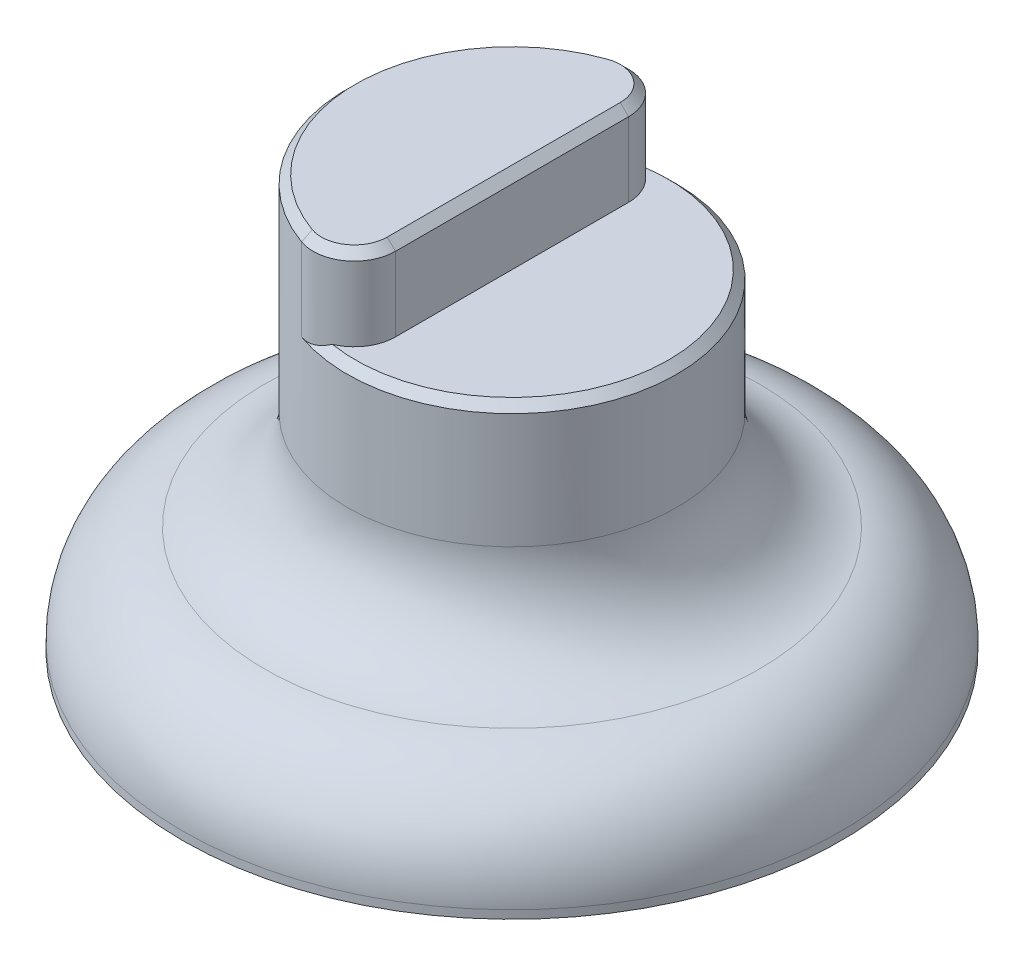
ISO-10303-21;
HEADER;
FILE_DESCRIPTION(('STEP AP214'),'2;1');
FILE_NAME('part.step','',(''),(''),'','','');
FILE_SCHEMA(('AUTOMOTIVE_DESIGN { 1 0 10303 214 1 1 1 1 }'));
ENDSEC;
DATA;
#1=APPLICATION_CONTEXT('core data for automotive mechanical design processes');
#2=APPLICATION_PROTOCOL_DEFINITION('international standard','automotive_design',2000,#1);
#3=PRODUCT_CONTEXT('',#1,'mechanical');
#4=PRODUCT('Part','Part','',(#3));
#5=PRODUCT_RELATED_PRODUCT_CATEGORY('part','',(#4));
#6=PRODUCT_DEFINITION_FORMATION('','',#4);
#7=PRODUCT_DEFINITION_CONTEXT('part definition',#1,'design');
#8=PRODUCT_DEFINITION('design','',#6,#7);
#9=PRODUCT_DEFINITION_SHAPE('','',#8);
#10=(LENGTH_UNIT() NAMED_UNIT(*) SI_UNIT(.MILLI.,.METRE.));
#11=(NAMED_UNIT(*) PLANE_ANGLE_UNIT() SI_UNIT($,.RADIAN.));
#12=(NAMED_UNIT(*) SI_UNIT($,.STERADIAN.) SOLID_ANGLE_UNIT());
#13=UNCERTAINTY_MEASURE_WITH_UNIT(LENGTH_MEASURE(1.E-05),#10,'distance_accuracy_value','');
#14=(GEOMETRIC_REPRESENTATION_CONTEXT(3) GLOBAL_UNCERTAINTY_ASSIGNED_CONTEXT((#13)) GLOBAL_UNIT_ASSIGNED_CONTEXT((#10,
#11,#12)) REPRESENTATION_CONTEXT('',''));
#15=CARTESIAN_POINT('',(0.,0.,0.));
#16=DIRECTION('',(0.,0.,1.));
#17=DIRECTION('',(1.,0.,0.));
#18=AXIS2_PLACEMENT_3D('',#15,#16,#17);
#19=CARTESIAN_POINT('',(0.,0.,0.));
#20=DIRECTION('',(0.,-1.,0.));
#21=DIRECTION('',(0.,0.,-1.));
#22=AXIS2_PLACEMENT_3D('',#19,#20,#21);
#23=PLANE('',#22);
#24=CARTESIAN_POINT('',(0.,0.,0.));
#25=DIRECTION('',(0.,-1.,0.));
#26=DIRECTION('',(0.,0.,-1.));
#27=AXIS2_PLACEMENT_3D('',#24,#25,#26);
#28=CIRCLE('',#27,40.);
#29=CARTESIAN_POINT('',(0.,0.,-40.));
#30=VERTEX_POINT('',#29);
#31=EDGE_CURVE('E153',#30,#30,#28,.T.);
#32=ORIENTED_EDGE('',*,*,#31,.T.);
#33=EDGE_LOOP('',(#32));
#34=FACE_BOUND('',#33,.T.);
#35=ADVANCED_FACE('F47',(#34),#23,.T.);
#36=CARTESIAN_POINT('',(0.,0.,0.));
#37=DIRECTION('',(0.,-1.,0.));
#38=DIRECTION('',(0.,0.,-1.));
#39=AXIS2_PLACEMENT_3D('',#36,#37,#38);
#40=CYLINDRICAL_SURFACE('',#39,40.);
#41=CARTESIAN_POINT('',(0.,1.,0.));
#42=DIRECTION('',(0.,-1.,0.));
#43=DIRECTION('',(0.,0.,-1.));
#44=AXIS2_PLACEMENT_3D('',#41,#42,#43);
#45=CIRCLE('',#44,40.);
#46=CARTESIAN_POINT('',(0.,1.,-40.));
#47=VERTEX_POINT('',#46);
#48=EDGE_CURVE('E149',#47,#47,#45,.T.);
#49=ORIENTED_EDGE('',*,*,#48,.T.);
#50=EDGE_LOOP('',(#49));
#51=FACE_BOUND('',#50,.T.);
#52=ORIENTED_EDGE('',*,*,#31,.F.);
#53=EDGE_LOOP('',(#52));
#54=FACE_BOUND('',#53,.T.);
#55=ADVANCED_FACE('F242',(#51,#54),#40,.T.);
#56=CARTESIAN_POINT('',(0.,1.,0.));
#57=DIRECTION('',(0.,-1.,0.));
#58=DIRECTION('',(0.,0.,-1.));
#59=AXIS2_PLACEMENT_3D('',#56,#57,#58);
#60=TOROIDAL_SURFACE('',#59,27.8000000000001,12.2);
#61=CARTESIAN_POINT('',(0.,13.,0.));
#62=DIRECTION('',(0.,-1.,0.));
#63=DIRECTION('',(0.,0.,-1.));
#64=AXIS2_PLACEMENT_3D('',#61,#62,#63);
#65=CIRCLE('',#64,30.);
#66=CARTESIAN_POINT('',(0.,13.,-30.));
#67=VERTEX_POINT('',#66);
#68=EDGE_CURVE('E141',#67,#67,#65,.T.);
#69=ORIENTED_EDGE('',*,*,#68,.T.);
#70=EDGE_LOOP('',(#69));
#71=FACE_BOUND('',#70,.T.);
#72=ORIENTED_EDGE('',*,*,#48,.F.);
#73=EDGE_LOOP('',(#72));
#74=FACE_BOUND('',#73,.T.);
#75=ADVANCED_FACE('F247',(#71,#74),#60,.T.);
#76=CARTESIAN_POINT('',(0.,25.,0.));
#77=DIRECTION('',(0.,-1.,0.));
#78=DIRECTION('',(0.,0.,-1.));
#79=AXIS2_PLACEMENT_3D('',#76,#77,#78);
#80=TOROIDAL_SURFACE('',#79,32.2,12.2);
#81=CARTESIAN_POINT('',(0.,25.,0.));
#82=DIRECTION('',(0.,-1.,0.));
#83=DIRECTION('',(0.,0.,-1.));
#84=AXIS2_PLACEMENT_3D('',#81,#82,#83);
#85=CIRCLE('',#84,20.);
#86=CARTESIAN_POINT('',(0.,25.,-20.));
#87=VERTEX_POINT('',#86);
#88=EDGE_CURVE('E136',#87,#87,#85,.T.);
#89=ORIENTED_EDGE('',*,*,#88,.T.);
#90=EDGE_LOOP('',(#89));
#91=FACE_BOUND('',#90,.T.);
#92=ORIENTED_EDGE('',*,*,#68,.F.);
#93=EDGE_LOOP('',(#92));
#94=FACE_BOUND('',#93,.T.);
#95=ADVANCED_FACE('F253',(#91,#94),#80,.F.);
#96=CARTESIAN_POINT('',(0.,0.,0.));
#97=DIRECTION('',(0.,-1.,0.));
#98=DIRECTION('',(0.,0.,-1.));
#99=AXIS2_PLACEMENT_3D('',#96,#97,#98);
#100=CYLINDRICAL_SURFACE('',#99,20.);
#101=DIRECTION('',(0.,-1.,0.));
#102=VECTOR('',#101,1.);
#103=CARTESIAN_POINT('',(-6.66666666666666,0.,18.8561808316413));
#104=LINE('',#103,#102);
#105=CARTESIAN_POINT('',(-6.66666666666666,39.,18.8561808316413));
#106=VERTEX_POINT('',#105);
#107=CARTESIAN_POINT('',(-6.66666666666666,49.,18.8561808316413));
#108=VERTEX_POINT('',#107);
#109=EDGE_CURVE('E67',#106,#108,#104,.F.);
#110=ORIENTED_EDGE('',*,*,#109,.T.);
#111=CARTESIAN_POINT('',(0.,49.,0.));
#112=DIRECTION('',(0.,1.,0.));
#113=DIRECTION('',(0.,0.,1.));
#114=AXIS2_PLACEMENT_3D('',#111,#112,#113);
#115=CIRCLE('',#114,20.);
#116=CARTESIAN_POINT('',(-6.66666666666666,49.,-18.8561808316413));
#117=VERTEX_POINT('',#116);
#118=EDGE_CURVE('E188',#108,#117,#115,.F.);
#119=ORIENTED_EDGE('',*,*,#118,.T.);
#120=DIRECTION('',(0.,-1.,0.));
#121=VECTOR('',#120,1.);
#122=CARTESIAN_POINT('',(-6.66666666666666,0.,-18.8561808316413));
#123=LINE('',#122,#121);
#124=CARTESIAN_POINT('',(-6.66666666666666,39.,-18.8561808316413));
#125=VERTEX_POINT('',#124);
#126=EDGE_CURVE('E75',#117,#125,#123,.T.);
#127=ORIENTED_EDGE('',*,*,#126,.T.);
#128=CARTESIAN_POINT('',(0.,39.,0.));
#129=DIRECTION('',(0.,1.,0.));
#130=DIRECTION('',(0.,0.,1.));
#131=AXIS2_PLACEMENT_3D('',#128,#129,#130);
#132=CIRCLE('',#131,20.);
#133=EDGE_CURVE('E185',#125,#106,#132,.F.);
#134=ORIENTED_EDGE('',*,*,#133,.T.);
#135=EDGE_LOOP('',(#110,#119,#127,#134));
#136=FACE_BOUND('',#135,.T.);
#137=ORIENTED_EDGE('',*,*,#88,.F.);
#138=EDGE_LOOP('',(#137));
#139=FACE_BOUND('',#138,.T.);
#140=ADVANCED_FACE('F257',(#136,#139),#100,.T.);
#141=CARTESIAN_POINT('',(0.,40.,0.));
#142=DIRECTION('',(0.,1.,0.));
#143=DIRECTION('',(0.,0.,1.));
#144=AXIS2_PLACEMENT_3D('',#141,#142,#143);
#145=PLANE('',#144);
#146=CARTESIAN_POINT('',(-5.,40.,14.142135623731));
#147=DIRECTION('',(0.,1.,0.));
#148=DIRECTION('',(0.,0.,1.));
#149=AXIS2_PLACEMENT_3D('',#146,#147,#148);
#150=CIRCLE('',#149,5.);
#151=CARTESIAN_POINT('',(0.,40.,14.142135623731));
#152=VERTEX_POINT('',#151);
#153=CARTESIAN_POINT('',(-3.06263414650818,40.,18.7515405256379));
#154=VERTEX_POINT('',#153);
#155=EDGE_CURVE('E125',#152,#154,#150,.F.);
#156=ORIENTED_EDGE('',*,*,#155,.T.);
#157=CARTESIAN_POINT('',(0.,40.,0.));
#158=DIRECTION('',(0.,1.,0.));
#159=DIRECTION('',(0.,0.,1.));
#160=AXIS2_PLACEMENT_3D('',#157,#158,#159);
#161=CIRCLE('',#160,19.);
#162=CARTESIAN_POINT('',(-3.06263414650818,40.,-18.7515405256379));
#163=VERTEX_POINT('',#162);
#164=EDGE_CURVE('E191',#154,#163,#161,.T.);
#165=ORIENTED_EDGE('',*,*,#164,.T.);
#166=CARTESIAN_POINT('',(-5.,40.,-14.142135623731));
#167=DIRECTION('',(0.,1.,0.));
#168=DIRECTION('',(0.,0.,1.));
#169=AXIS2_PLACEMENT_3D('',#166,#167,#168);
#170=CIRCLE('',#169,5.);
#171=CARTESIAN_POINT('',(0.,40.,-14.142135623731));
#172=VERTEX_POINT('',#171);
#173=EDGE_CURVE('E131',#163,#172,#170,.F.);
#174=ORIENTED_EDGE('',*,*,#173,.T.);
#175=DIRECTION('',(0.,0.,-1.));
#176=VECTOR('',#175,1.);
#177=CARTESIAN_POINT('',(0.,40.,-20.));
#178=LINE('',#177,#176);
#179=EDGE_CURVE('E117',#152,#172,#178,.T.);
#180=ORIENTED_EDGE('',*,*,#179,.F.);
#181=EDGE_LOOP('',(#156,#165,#174,#180));
#182=FACE_BOUND('',#181,.T.);
#183=ADVANCED_FACE('F133',(#182),#145,.T.);
#184=CARTESIAN_POINT('',(0.,50.,-20.));
#185=DIRECTION('',(-1.,0.,0.));
#186=DIRECTION('',(0.,0.,1.));
#187=AXIS2_PLACEMENT_3D('',#184,#185,#186);
#188=PLANE('',#187);
#189=DIRECTION('',(0.,1.,0.));
#190=VECTOR('',#189,1.);
#191=CARTESIAN_POINT('',(0.,50.,-14.142135623731));
#192=LINE('',#191,#190);
#193=CARTESIAN_POINT('',(0.,49.,-14.142135623731));
#194=VERTEX_POINT('',#193);
#195=EDGE_CURVE('E122',#172,#194,#192,.T.);
#196=ORIENTED_EDGE('',*,*,#195,.T.);
#197=DIRECTION('',(0.,0.,1.));
#198=VECTOR('',#197,1.);
#199=CARTESIAN_POINT('',(0.,49.,14.142135623731));
#200=LINE('',#199,#198);
#201=CARTESIAN_POINT('',(0.,49.,14.142135623731));
#202=VERTEX_POINT('',#201);
#203=EDGE_CURVE('E120',#194,#202,#200,.T.);
#204=ORIENTED_EDGE('',*,*,#203,.T.);
#205=DIRECTION('',(0.,1.,0.));
#206=VECTOR('',#205,1.);
#207=CARTESIAN_POINT('',(0.,40.,14.142135623731));
#208=LINE('',#207,#206);
#209=EDGE_CURVE('E112',#202,#152,#208,.F.);
#210=ORIENTED_EDGE('',*,*,#209,.T.);
#211=ORIENTED_EDGE('',*,*,#179,.T.);
#212=EDGE_LOOP('',(#196,#204,#210,#211));
#213=FACE_BOUND('',#212,.T.);
#214=ADVANCED_FACE('F115',(#213),#188,.F.);
#215=CARTESIAN_POINT('',(0.,50.,0.));
#216=DIRECTION('',(0.,1.,0.));
#217=DIRECTION('',(0.,0.,1.));
#218=AXIS2_PLACEMENT_3D('',#215,#216,#217);
#219=PLANE('',#218);
#220=CARTESIAN_POINT('',(-5.,50.,14.142135623731));
#221=DIRECTION('',(0.,1.,0.));
#222=DIRECTION('',(0.,0.,1.));
#223=AXIS2_PLACEMENT_3D('',#220,#221,#222);
#224=CIRCLE('',#223,3.99999999999997);
#225=CARTESIAN_POINT('',(-6.33333333333332,50.,17.9133717900592));
#226=VERTEX_POINT('',#225);
#227=CARTESIAN_POINT('',(-1.00000000000002,50.,14.142135623731));
#228=VERTEX_POINT('',#227);
#229=EDGE_CURVE('E167',#226,#228,#224,.T.);
#230=ORIENTED_EDGE('',*,*,#229,.T.);
#231=DIRECTION('',(0.,0.,-1.));
#232=VECTOR('',#231,1.);
#233=CARTESIAN_POINT('',(-1.00000000000002,50.,-14.142135623731));
#234=LINE('',#233,#232);
#235=CARTESIAN_POINT('',(-1.00000000000002,50.,-14.142135623731));
#236=VERTEX_POINT('',#235);
#237=EDGE_CURVE('E173',#228,#236,#234,.T.);
#238=ORIENTED_EDGE('',*,*,#237,.T.);
#239=CARTESIAN_POINT('',(-5.,50.,-14.142135623731));
#240=DIRECTION('',(0.,1.,0.));
#241=DIRECTION('',(0.,0.,1.));
#242=AXIS2_PLACEMENT_3D('',#239,#240,#241);
#243=CIRCLE('',#242,3.99999999999998);
#244=CARTESIAN_POINT('',(-6.33333333333332,50.,-17.9133717900592));
#245=VERTEX_POINT('',#244);
#246=EDGE_CURVE('E170',#236,#245,#243,.T.);
#247=ORIENTED_EDGE('',*,*,#246,.T.);
#248=CARTESIAN_POINT('',(0.,50.,0.));
#249=DIRECTION('',(0.,1.,0.));
#250=DIRECTION('',(0.,0.,1.));
#251=AXIS2_PLACEMENT_3D('',#248,#249,#250);
#252=CIRCLE('',#251,19.);
#253=EDGE_CURVE('E130',#245,#226,#252,.T.);
#254=ORIENTED_EDGE('',*,*,#253,.T.);
#255=EDGE_LOOP('',(#230,#238,#247,#254));
#256=FACE_BOUND('',#255,.T.);
#257=ADVANCED_FACE('F265',(#256),#219,.T.);
#258=CARTESIAN_POINT('',(-5.,0.,-14.142135623731));
#259=DIRECTION('',(0.,-1.,0.));
#260=DIRECTION('',(0.,0.,-1.));
#261=AXIS2_PLACEMENT_3D('',#258,#259,#260);
#262=CYLINDRICAL_SURFACE('',#261,5.);
#263=ORIENTED_EDGE('',*,*,#126,.F.);
#264=CARTESIAN_POINT('',(-5.,49.,-14.142135623731));
#265=DIRECTION('',(0.,1.,0.));
#266=DIRECTION('',(0.,0.,1.));
#267=AXIS2_PLACEMENT_3D('',#264,#265,#266);
#268=CIRCLE('',#267,5.);
#269=EDGE_CURVE('E179',#117,#194,#268,.F.);
#270=ORIENTED_EDGE('',*,*,#269,.T.);
#271=ORIENTED_EDGE('',*,*,#195,.F.);
#272=ORIENTED_EDGE('',*,*,#173,.F.);
#273=CARTESIAN_POINT('',(-3.06263414650818,40.,-18.7515405256379));
#274=CARTESIAN_POINT('',(-3.17068715670107,39.9377539333801,-18.7969640933823));
#275=CARTESIAN_POINT('',(-3.28141593089094,39.8776152992095,-18.8390247297172));
#276=CARTESIAN_POINT('',(-3.50786200638211,39.7619805174951,-18.9157936940181));
#277=CARTESIAN_POINT('',(-3.6235834688816,39.7064883604557,-18.9504957406612));
#278=CARTESIAN_POINT('',(-3.86030506638808,39.6003055371669,-19.012059645521));
#279=CARTESIAN_POINT('',(-3.98133687890565,39.5496518087796,-19.0388640146547));
#280=CARTESIAN_POINT('',(-4.22722781641227,39.4541227707975,-19.0836367255504));
#281=CARTESIAN_POINT('',(-4.35208587103747,39.4092458631212,-19.1016075149004));
#282=CARTESIAN_POINT('',(-4.60561922192087,39.3255227683055,-19.1281964912013));
#283=CARTESIAN_POINT('',(-4.73431257478366,39.286713393053,-19.1367593557155));
#284=CARTESIAN_POINT('',(-4.99383932827166,39.2159525236175,-19.143816139493));
#285=CARTESIAN_POINT('',(-5.12467243450065,39.1840000944287,-19.1423114324611));
#286=CARTESIAN_POINT('',(-5.38680022061267,39.1275322370733,-19.1288710531826));
#287=CARTESIAN_POINT('',(-5.51809022743472,39.1029842229659,-19.1169820096444));
#288=CARTESIAN_POINT('',(-5.78042704289464,39.0615246768322,-19.0826234686476));
#289=CARTESIAN_POINT('',(-5.91147395147262,39.044608454822,-19.06016048661));
#290=CARTESIAN_POINT('',(-6.14731738416257,39.0211371265957,-19.009917867349));
#291=CARTESIAN_POINT('',(-6.25237149490883,39.0132242188236,-18.9839588334616));
#292=CARTESIAN_POINT('',(-6.46089718770928,39.0026490565827,-18.9251850429007));
#293=CARTESIAN_POINT('',(-6.56436752317226,38.9999907463747,-18.8923651566799));
#294=CARTESIAN_POINT('',(-6.66666666666666,39.,-18.8561808316413));
#295=B_SPLINE_CURVE_WITH_KNOTS('',3,(#273,#274,#275,#276,#277,#278,#279,#280,#281,#282,#283,
#284,#285,#286,#287,#288,#289,#290,#291,#292,#293,#294),.UNSPECIFIED.,.F.,.F.,(4,2,2,2,2,2,2,2,
2,2,4),(0.,0.39811809683829,0.796574672987551,1.19786384899586,1.59904177396263,
2.00256636775839,2.40603590236431,2.80770300097124,3.20912292475614,3.53428682255703,
3.85969470572249),.UNSPECIFIED.);
#296=EDGE_CURVE('E11',#163,#125,#295,.T.);
#297=ORIENTED_EDGE('',*,*,#296,.T.);
#298=EDGE_LOOP('',(#263,#270,#271,#272,#297));
#299=FACE_BOUND('',#298,.T.);
#300=ADVANCED_FACE('F210',(#299),#262,.T.);
#301=CARTESIAN_POINT('',(-5.,0.,14.142135623731));
#302=DIRECTION('',(0.,-1.,0.));
#303=DIRECTION('',(0.,0.,-1.));
#304=AXIS2_PLACEMENT_3D('',#301,#302,#303);
#305=CYLINDRICAL_SURFACE('',#304,5.);
#306=ORIENTED_EDGE('',*,*,#209,.F.);
#307=CARTESIAN_POINT('',(-5.,49.,14.142135623731));
#308=DIRECTION('',(0.,1.,0.));
#309=DIRECTION('',(0.,0.,1.));
#310=AXIS2_PLACEMENT_3D('',#307,#308,#309);
#311=CIRCLE('',#310,5.);
#312=EDGE_CURVE('E182',#202,#108,#311,.F.);
#313=ORIENTED_EDGE('',*,*,#312,.T.);
#314=ORIENTED_EDGE('',*,*,#109,.F.);
#315=CARTESIAN_POINT('',(-6.66666666666666,39.,18.8561808316413));
#316=CARTESIAN_POINT('',(-6.55349692135122,38.9999843029459,18.8962192172407));
#317=CARTESIAN_POINT('',(-6.43888021251788,39.0032415848417,18.9321313374616));
#318=CARTESIAN_POINT('',(-6.20775139816861,39.016185184691,18.9955491193224));
#319=CARTESIAN_POINT('',(-6.09124012149923,39.0258687613241,19.0230583581489));
#320=CARTESIAN_POINT('',(-5.85799955790685,39.051462952574,19.0693964641732));
#321=CARTESIAN_POINT('',(-5.74127685589985,39.0673317913012,19.0882817580154));
#322=CARTESIAN_POINT('',(-5.50775116239042,39.1050886572672,19.1176793157481));
#323=CARTESIAN_POINT('',(-5.39094816731321,39.1269769725035,19.1281911789245));
#324=CARTESIAN_POINT('',(-5.15829421199333,39.176469216409,19.140985317515));
#325=CARTESIAN_POINT('',(-5.0424420986422,39.2040646385775,19.1432797489122));
#326=CARTESIAN_POINT('',(-4.8122409122945,39.2646900730245,19.1399355916202));
#327=CARTESIAN_POINT('',(-4.69789250490128,39.2977224098991,19.1342936018306));
#328=CARTESIAN_POINT('',(-4.47125115830337,39.3689279900472,19.1154017600578));
#329=CARTESIAN_POINT('',(-4.35896183091808,39.4071094372536,19.1021396549003));
#330=CARTESIAN_POINT('',(-4.13720287606214,39.4882157359453,19.0684089209944));
#331=CARTESIAN_POINT('',(-4.02773384809237,39.5311415858388,19.047938773403));
#332=CARTESIAN_POINT('',(-3.76959905621198,39.6391732888837,18.9908259298232));
#333=CARTESIAN_POINT('',(-3.62250079099651,39.7063500990521,18.9509889408055));
#334=CARTESIAN_POINT('',(-3.33642143031841,39.8479522492596,18.8596586259388));
#335=CARTESIAN_POINT('',(-3.19740835507728,39.9223454115477,18.8082158016001));
#336=CARTESIAN_POINT('',(-3.06263414650818,40.,18.7515405256379));
#337=B_SPLINE_CURVE_WITH_KNOTS('',3,(#315,#316,#317,#318,#319,#320,#321,#322,#323,#324,#325,
#326,#327,#328,#329,#330,#331,#332,#333,#334,#335,#336),.UNSPECIFIED.,.F.,.F.,(4,2,2,2,2,2,2,2,
2,2,4),(0.,0.359990432660183,0.719827399691027,1.07727496928944,1.43473964367441,
1.7916753044266,2.14876397418585,2.50642845726292,2.86416835078136,3.36299050281758,
3.85968257581711),.UNSPECIFIED.);
#338=EDGE_CURVE('E59',#106,#154,#337,.T.);
#339=ORIENTED_EDGE('',*,*,#338,.T.);
#340=ORIENTED_EDGE('',*,*,#155,.F.);
#341=EDGE_LOOP('',(#306,#313,#314,#339,#340));
#342=FACE_BOUND('',#341,.T.);
#343=ADVANCED_FACE('F126',(#342),#305,.T.);
#344=CARTESIAN_POINT('',(0.,50.,0.));
#345=DIRECTION('',(0.,-1.,0.));
#346=DIRECTION('',(0.,0.,-1.));
#347=AXIS2_PLACEMENT_3D('',#344,#345,#346);
#348=CONICAL_SURFACE('',#347,19.,0.785398163397447);
#349=DIRECTION('',(0.235702260395515,0.707106781186548,0.666666666666666));
#350=VECTOR('',#349,1.);
#351=CARTESIAN_POINT('',(-6.66666666666666,49.,-18.8561808316413));
#352=LINE('',#351,#350);
#353=EDGE_CURVE('E144',#117,#245,#352,.T.);
#354=ORIENTED_EDGE('',*,*,#353,.F.);
#355=ORIENTED_EDGE('',*,*,#118,.F.);
#356=DIRECTION('',(-0.235702260395515,-0.707106781186548,0.666666666666666));
#357=VECTOR('',#356,1.);
#358=CARTESIAN_POINT('',(-6.33333333333332,50.,17.9133717900592));
#359=LINE('',#358,#357);
#360=EDGE_CURVE('E53',#226,#108,#359,.T.);
#361=ORIENTED_EDGE('',*,*,#360,.F.);
#362=ORIENTED_EDGE('',*,*,#253,.F.);
#363=EDGE_LOOP('',(#354,#355,#361,#362));
#364=FACE_BOUND('',#363,.T.);
#365=ADVANCED_FACE('F209',(#364),#348,.T.);
#366=CARTESIAN_POINT('',(-5.,50.,14.142135623731));
#367=DIRECTION('',(0.,-1.,0.));
#368=DIRECTION('',(0.,0.,-1.));
#369=AXIS2_PLACEMENT_3D('',#366,#367,#368);
#370=CONICAL_SURFACE('',#369,3.99999999999997,0.785398163397447);
#371=ORIENTED_EDGE('',*,*,#360,.T.);
#372=ORIENTED_EDGE('',*,*,#312,.F.);
#373=DIRECTION('',(0.707106781186547,-0.707106781186548,0.));
#374=VECTOR('',#373,1.);
#375=CARTESIAN_POINT('',(-1.00000000000002,50.,14.142135623731));
#376=LINE('',#375,#374);
#377=EDGE_CURVE('E278',#228,#202,#376,.T.);
#378=ORIENTED_EDGE('',*,*,#377,.F.);
#379=ORIENTED_EDGE('',*,*,#229,.F.);
#380=EDGE_LOOP('',(#371,#372,#378,#379));
#381=FACE_BOUND('',#380,.T.);
#382=ADVANCED_FACE('F227',(#381),#370,.T.);
#383=CARTESIAN_POINT('',(-5.,50.,-14.142135623731));
#384=DIRECTION('',(0.,-1.,0.));
#385=DIRECTION('',(0.,0.,-1.));
#386=AXIS2_PLACEMENT_3D('',#383,#384,#385);
#387=CONICAL_SURFACE('',#386,3.99999999999998,0.785398163397446);
#388=ORIENTED_EDGE('',*,*,#353,.T.);
#389=ORIENTED_EDGE('',*,*,#246,.F.);
#390=DIRECTION('',(-0.707106781186546,0.707106781186549,0.));
#391=VECTOR('',#390,1.);
#392=CARTESIAN_POINT('',(0.,49.,-14.142135623731));
#393=LINE('',#392,#391);
#394=EDGE_CURVE('E280',#194,#236,#393,.T.);
#395=ORIENTED_EDGE('',*,*,#394,.F.);
#396=ORIENTED_EDGE('',*,*,#269,.F.);
#397=EDGE_LOOP('',(#388,#389,#395,#396));
#398=FACE_BOUND('',#397,.T.);
#399=ADVANCED_FACE('F220',(#398),#387,.T.);
#400=CARTESIAN_POINT('',(-1.00000000000002,50.,0.));
#401=DIRECTION('',(0.707106781186549,0.707106781186546,0.));
#402=DIRECTION('',(0.,0.,1.));
#403=AXIS2_PLACEMENT_3D('',#400,#401,#402);
#404=PLANE('',#403);
#405=ORIENTED_EDGE('',*,*,#377,.T.);
#406=ORIENTED_EDGE('',*,*,#203,.F.);
#407=ORIENTED_EDGE('',*,*,#394,.T.);
#408=ORIENTED_EDGE('',*,*,#237,.F.);
#409=EDGE_LOOP('',(#405,#406,#407,#408));
#410=FACE_BOUND('',#409,.T.);
#411=ADVANCED_FACE('F214',(#410),#404,.T.);
#412=CARTESIAN_POINT('',(0.,39.,0.));
#413=DIRECTION('',(0.,-1.,0.));
#414=DIRECTION('',(0.,0.,-1.));
#415=AXIS2_PLACEMENT_3D('',#412,#413,#414);
#416=CONICAL_SURFACE('',#415,20.,0.785398163397453);
#417=ORIENTED_EDGE('',*,*,#296,.F.);
#418=ORIENTED_EDGE('',*,*,#164,.F.);
#419=ORIENTED_EDGE('',*,*,#338,.F.);
#420=ORIENTED_EDGE('',*,*,#133,.F.);
#421=EDGE_LOOP('',(#417,#418,#419,#420));
#422=FACE_BOUND('',#421,.T.);
#423=ADVANCED_FACE('F50',(#422),#416,.T.);
#424=CLOSED_SHELL('',(#35,#55,#75,#95,#140,#183,#214,#257,#300,#343,#365,#382,#399,#411,#423));
#425=MANIFOLD_SOLID_BREP('B2',#424);
#426=ADVANCED_BREP_SHAPE_REPRESENTATION('',(#18,#425),#14);
#427=SHAPE_DEFINITION_REPRESENTATION(#9,#426);
ENDSEC;
END-ISO-10303-21;
